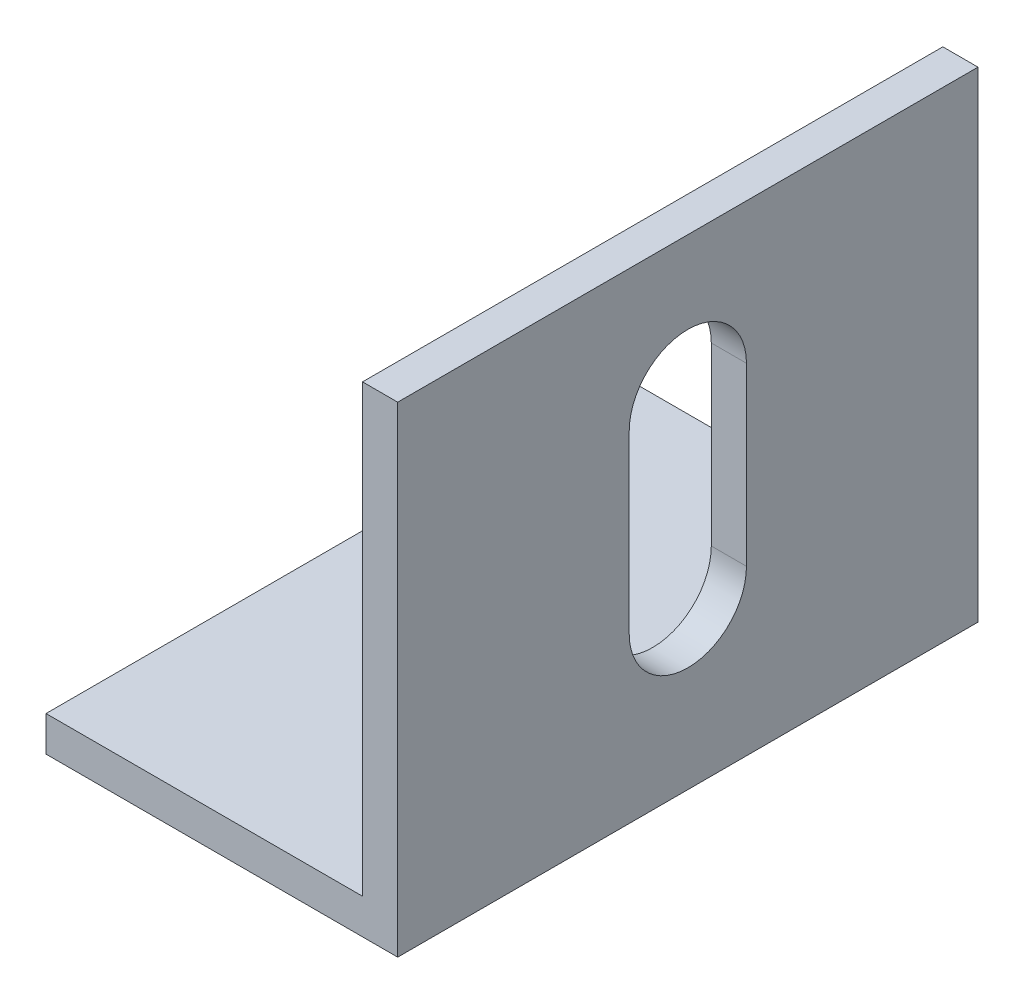
ISO-10303-21;
HEADER;
FILE_DESCRIPTION(('STEP AP214'),'2;1');
FILE_NAME('part.step','',(''),(''),'','','');
FILE_SCHEMA(('AUTOMOTIVE_DESIGN { 1 0 10303 214 1 1 1 1 }'));
ENDSEC;
DATA;
#1=APPLICATION_CONTEXT('core data for automotive mechanical design processes');
#2=APPLICATION_PROTOCOL_DEFINITION('international standard','automotive_design',2000,#1);
#3=PRODUCT_CONTEXT('',#1,'mechanical');
#4=PRODUCT('Part','Part','',(#3));
#5=PRODUCT_RELATED_PRODUCT_CATEGORY('part','',(#4));
#6=PRODUCT_DEFINITION_FORMATION('','',#4);
#7=PRODUCT_DEFINITION_CONTEXT('part definition',#1,'design');
#8=PRODUCT_DEFINITION('design','',#6,#7);
#9=PRODUCT_DEFINITION_SHAPE('','',#8);
#10=(LENGTH_UNIT() NAMED_UNIT(*) SI_UNIT(.MILLI.,.METRE.));
#11=(NAMED_UNIT(*) PLANE_ANGLE_UNIT() SI_UNIT($,.RADIAN.));
#12=(NAMED_UNIT(*) SI_UNIT($,.STERADIAN.) SOLID_ANGLE_UNIT());
#13=UNCERTAINTY_MEASURE_WITH_UNIT(LENGTH_MEASURE(1.E-05),#10,'distance_accuracy_value','');
#14=(GEOMETRIC_REPRESENTATION_CONTEXT(3) GLOBAL_UNCERTAINTY_ASSIGNED_CONTEXT((#13)) GLOBAL_UNIT_ASSIGNED_CONTEXT((#10,
#11,#12)) REPRESENTATION_CONTEXT('',''));
#15=CARTESIAN_POINT('',(0.,0.,0.));
#16=DIRECTION('',(0.,0.,1.));
#17=DIRECTION('',(1.,0.,0.));
#18=AXIS2_PLACEMENT_3D('',#15,#16,#17);
#19=CARTESIAN_POINT('',(0.,20.828,25.146));
#20=DIRECTION('',(-1.,0.,0.));
#21=DIRECTION('',(0.,-1.,0.));
#22=AXIS2_PLACEMENT_3D('',#19,#20,#21);
#23=PLANE('',#22);
#24=DIRECTION('',(0.,-1.,0.));
#25=VECTOR('',#24,1.);
#26=CARTESIAN_POINT('',(0.,14.732,15.113));
#27=LINE('',#26,#25);
#28=CARTESIAN_POINT('',(0.,14.732,15.113));
#29=VERTEX_POINT('',#28);
#30=CARTESIAN_POINT('',(0.,7.112,15.113));
#31=VERTEX_POINT('',#30);
#32=EDGE_CURVE('E132',#29,#31,#27,.T.);
#33=ORIENTED_EDGE('',*,*,#32,.F.);
#34=CARTESIAN_POINT('',(0.,14.732,12.573));
#35=DIRECTION('',(-1.,0.,0.));
#36=DIRECTION('',(0.,-1.,0.));
#37=AXIS2_PLACEMENT_3D('',#34,#35,#36);
#38=CIRCLE('',#37,2.54);
#39=CARTESIAN_POINT('',(0.,14.732,10.033));
#40=VERTEX_POINT('',#39);
#41=EDGE_CURVE('E115',#40,#29,#38,.F.);
#42=ORIENTED_EDGE('',*,*,#41,.F.);
#43=DIRECTION('',(0.,1.,0.));
#44=VECTOR('',#43,1.);
#45=CARTESIAN_POINT('',(0.,14.732,10.033));
#46=LINE('',#45,#44);
#47=CARTESIAN_POINT('',(0.,7.112,10.033));
#48=VERTEX_POINT('',#47);
#49=EDGE_CURVE('E124',#48,#40,#46,.T.);
#50=ORIENTED_EDGE('',*,*,#49,.F.);
#51=CARTESIAN_POINT('',(0.,7.112,12.573));
#52=DIRECTION('',(-1.,0.,0.));
#53=DIRECTION('',(0.,-1.,0.));
#54=AXIS2_PLACEMENT_3D('',#51,#52,#53);
#55=CIRCLE('',#54,2.54);
#56=EDGE_CURVE('E51',#31,#48,#55,.F.);
#57=ORIENTED_EDGE('',*,*,#56,.F.);
#58=EDGE_LOOP('',(#33,#42,#50,#57));
#59=FACE_BOUND('',#58,.T.);
#60=DIRECTION('',(0.,1.,0.));
#61=VECTOR('',#60,1.);
#62=CARTESIAN_POINT('',(0.,20.828,0.));
#63=LINE('',#62,#61);
#64=CARTESIAN_POINT('',(0.,0.,0.));
#65=VERTEX_POINT('',#64);
#66=CARTESIAN_POINT('',(0.,20.828,0.));
#67=VERTEX_POINT('',#66);
#68=EDGE_CURVE('E127',#65,#67,#63,.T.);
#69=ORIENTED_EDGE('',*,*,#68,.T.);
#70=DIRECTION('',(0.,0.,-1.));
#71=VECTOR('',#70,1.);
#72=CARTESIAN_POINT('',(0.,20.828,25.146));
#73=LINE('',#72,#71);
#74=CARTESIAN_POINT('',(0.,20.828,25.146));
#75=VERTEX_POINT('',#74);
#76=EDGE_CURVE('E11',#75,#67,#73,.T.);
#77=ORIENTED_EDGE('',*,*,#76,.F.);
#78=DIRECTION('',(0.,1.,0.));
#79=VECTOR('',#78,1.);
#80=CARTESIAN_POINT('',(0.,20.828,25.146));
#81=LINE('',#80,#79);
#82=CARTESIAN_POINT('',(0.,0.,25.146));
#83=VERTEX_POINT('',#82);
#84=EDGE_CURVE('E149',#83,#75,#81,.T.);
#85=ORIENTED_EDGE('',*,*,#84,.F.);
#86=DIRECTION('',(0.,0.,-1.));
#87=VECTOR('',#86,1.);
#88=CARTESIAN_POINT('',(0.,0.,25.146));
#89=LINE('',#88,#87);
#90=EDGE_CURVE('E163',#83,#65,#89,.T.);
#91=ORIENTED_EDGE('',*,*,#90,.T.);
#92=EDGE_LOOP('',(#69,#77,#85,#91));
#93=FACE_BOUND('',#92,.T.);
#94=ADVANCED_FACE('F37',(#59,#93),#23,.F.);
#95=CARTESIAN_POINT('',(-1.524,20.828,25.146));
#96=DIRECTION('',(0.,-1.,0.));
#97=DIRECTION('',(0.,0.,-1.));
#98=AXIS2_PLACEMENT_3D('',#95,#96,#97);
#99=PLANE('',#98);
#100=DIRECTION('',(-1.,0.,0.));
#101=VECTOR('',#100,1.);
#102=CARTESIAN_POINT('',(-1.524,20.828,0.));
#103=LINE('',#102,#101);
#104=CARTESIAN_POINT('',(-1.524,20.828,0.));
#105=VERTEX_POINT('',#104);
#106=EDGE_CURVE('E166',#67,#105,#103,.T.);
#107=ORIENTED_EDGE('',*,*,#106,.T.);
#108=DIRECTION('',(0.,0.,-1.));
#109=VECTOR('',#108,1.);
#110=CARTESIAN_POINT('',(-1.524,20.828,25.146));
#111=LINE('',#110,#109);
#112=CARTESIAN_POINT('',(-1.524,20.828,25.146));
#113=VERTEX_POINT('',#112);
#114=EDGE_CURVE('E44',#113,#105,#111,.T.);
#115=ORIENTED_EDGE('',*,*,#114,.F.);
#116=DIRECTION('',(-1.,0.,0.));
#117=VECTOR('',#116,1.);
#118=CARTESIAN_POINT('',(-1.524,20.828,25.146));
#119=LINE('',#118,#117);
#120=EDGE_CURVE('E152',#75,#113,#119,.T.);
#121=ORIENTED_EDGE('',*,*,#120,.F.);
#122=ORIENTED_EDGE('',*,*,#76,.T.);
#123=EDGE_LOOP('',(#107,#115,#121,#122));
#124=FACE_BOUND('',#123,.T.);
#125=ADVANCED_FACE('F213',(#124),#99,.F.);
#126=CARTESIAN_POINT('',(-1.524,1.524,25.146));
#127=DIRECTION('',(1.,0.,0.));
#128=DIRECTION('',(0.,0.,-1.));
#129=AXIS2_PLACEMENT_3D('',#126,#127,#128);
#130=PLANE('',#129);
#131=DIRECTION('',(0.,-1.,0.));
#132=VECTOR('',#131,1.);
#133=CARTESIAN_POINT('',(-1.524,14.732,10.033));
#134=LINE('',#133,#132);
#135=CARTESIAN_POINT('',(-1.524,14.732,10.033));
#136=VERTEX_POINT('',#135);
#137=CARTESIAN_POINT('',(-1.524,7.112,10.033));
#138=VERTEX_POINT('',#137);
#139=EDGE_CURVE('E134',#136,#138,#134,.T.);
#140=ORIENTED_EDGE('',*,*,#139,.F.);
#141=CARTESIAN_POINT('',(-1.524,14.732,12.573));
#142=DIRECTION('',(-1.,0.,0.));
#143=DIRECTION('',(0.,0.,1.));
#144=AXIS2_PLACEMENT_3D('',#141,#142,#143);
#145=CIRCLE('',#144,2.54);
#146=CARTESIAN_POINT('',(-1.524,14.732,15.113));
#147=VERTEX_POINT('',#146);
#148=EDGE_CURVE('E59',#147,#136,#145,.T.);
#149=ORIENTED_EDGE('',*,*,#148,.F.);
#150=DIRECTION('',(0.,1.,0.));
#151=VECTOR('',#150,1.);
#152=CARTESIAN_POINT('',(-1.524,14.732,15.113));
#153=LINE('',#152,#151);
#154=CARTESIAN_POINT('',(-1.524,7.112,15.113));
#155=VERTEX_POINT('',#154);
#156=EDGE_CURVE('E121',#155,#147,#153,.T.);
#157=ORIENTED_EDGE('',*,*,#156,.F.);
#158=CARTESIAN_POINT('',(-1.524,7.112,12.573));
#159=DIRECTION('',(-1.,0.,0.));
#160=DIRECTION('',(0.,0.,1.));
#161=AXIS2_PLACEMENT_3D('',#158,#159,#160);
#162=CIRCLE('',#161,2.54);
#163=EDGE_CURVE('E140',#138,#155,#162,.T.);
#164=ORIENTED_EDGE('',*,*,#163,.F.);
#165=EDGE_LOOP('',(#140,#149,#157,#164));
#166=FACE_BOUND('',#165,.T.);
#167=DIRECTION('',(0.,-1.,0.));
#168=VECTOR('',#167,1.);
#169=CARTESIAN_POINT('',(-1.524,1.524,0.));
#170=LINE('',#169,#168);
#171=CARTESIAN_POINT('',(-1.524,1.524,0.));
#172=VERTEX_POINT('',#171);
#173=EDGE_CURVE('E168',#105,#172,#170,.T.);
#174=ORIENTED_EDGE('',*,*,#173,.T.);
#175=DIRECTION('',(0.,0.,-1.));
#176=VECTOR('',#175,1.);
#177=CARTESIAN_POINT('',(-1.524,1.524,25.146));
#178=LINE('',#177,#176);
#179=CARTESIAN_POINT('',(-1.524,1.524,25.146));
#180=VERTEX_POINT('',#179);
#181=EDGE_CURVE('E183',#180,#172,#178,.T.);
#182=ORIENTED_EDGE('',*,*,#181,.F.);
#183=DIRECTION('',(0.,-1.,0.));
#184=VECTOR('',#183,1.);
#185=CARTESIAN_POINT('',(-1.524,1.524,25.146));
#186=LINE('',#185,#184);
#187=EDGE_CURVE('E155',#113,#180,#186,.T.);
#188=ORIENTED_EDGE('',*,*,#187,.F.);
#189=ORIENTED_EDGE('',*,*,#114,.T.);
#190=EDGE_LOOP('',(#174,#182,#188,#189));
#191=FACE_BOUND('',#190,.T.);
#192=ADVANCED_FACE('F190',(#166,#191),#130,.F.);
#193=CARTESIAN_POINT('',(-1.524,1.524,25.146));
#194=DIRECTION('',(0.,-1.,0.));
#195=DIRECTION('',(1.,0.,0.));
#196=AXIS2_PLACEMENT_3D('',#193,#194,#195);
#197=PLANE('',#196);
#198=CARTESIAN_POINT('',(-6.731,1.524,12.573));
#199=DIRECTION('',(0.,1.,0.));
#200=DIRECTION('',(-1.,0.,0.));
#201=AXIS2_PLACEMENT_3D('',#198,#199,#200);
#202=CIRCLE('',#201,2.54);
#203=CARTESIAN_POINT('',(-9.271,1.524,12.573));
#204=VERTEX_POINT('',#203);
#205=EDGE_CURVE('E243',#204,#204,#202,.T.);
#206=ORIENTED_EDGE('',*,*,#205,.F.);
#207=EDGE_LOOP('',(#206));
#208=FACE_BOUND('',#207,.T.);
#209=DIRECTION('',(-1.,0.,0.));
#210=VECTOR('',#209,1.);
#211=CARTESIAN_POINT('',(-1.524,1.524,0.));
#212=LINE('',#211,#210);
#213=CARTESIAN_POINT('',(-15.24,1.524,0.));
#214=VERTEX_POINT('',#213);
#215=EDGE_CURVE('E170',#172,#214,#212,.T.);
#216=ORIENTED_EDGE('',*,*,#215,.T.);
#217=DIRECTION('',(0.,0.,-1.));
#218=VECTOR('',#217,1.);
#219=CARTESIAN_POINT('',(-15.24,1.524,25.146));
#220=LINE('',#219,#218);
#221=CARTESIAN_POINT('',(-15.24,1.524,25.146));
#222=VERTEX_POINT('',#221);
#223=EDGE_CURVE('E180',#222,#214,#220,.T.);
#224=ORIENTED_EDGE('',*,*,#223,.F.);
#225=DIRECTION('',(-1.,0.,0.));
#226=VECTOR('',#225,1.);
#227=CARTESIAN_POINT('',(-1.524,1.524,25.146));
#228=LINE('',#227,#226);
#229=EDGE_CURVE('E157',#180,#222,#228,.T.);
#230=ORIENTED_EDGE('',*,*,#229,.F.);
#231=ORIENTED_EDGE('',*,*,#181,.T.);
#232=EDGE_LOOP('',(#216,#224,#230,#231));
#233=FACE_BOUND('',#232,.T.);
#234=ADVANCED_FACE('F201',(#208,#233),#197,.F.);
#235=CARTESIAN_POINT('',(-15.24,0.,25.146));
#236=DIRECTION('',(1.,0.,0.));
#237=DIRECTION('',(0.,0.,-1.));
#238=AXIS2_PLACEMENT_3D('',#235,#236,#237);
#239=PLANE('',#238);
#240=DIRECTION('',(0.,-1.,0.));
#241=VECTOR('',#240,1.);
#242=CARTESIAN_POINT('',(-15.24,0.,0.));
#243=LINE('',#242,#241);
#244=CARTESIAN_POINT('',(-15.24,0.,0.));
#245=VERTEX_POINT('',#244);
#246=EDGE_CURVE('E172',#214,#245,#243,.T.);
#247=ORIENTED_EDGE('',*,*,#246,.T.);
#248=DIRECTION('',(0.,0.,-1.));
#249=VECTOR('',#248,1.);
#250=CARTESIAN_POINT('',(-15.24,0.,25.146));
#251=LINE('',#250,#249);
#252=CARTESIAN_POINT('',(-15.24,0.,25.146));
#253=VERTEX_POINT('',#252);
#254=EDGE_CURVE('E177',#253,#245,#251,.T.);
#255=ORIENTED_EDGE('',*,*,#254,.F.);
#256=DIRECTION('',(0.,-1.,0.));
#257=VECTOR('',#256,1.);
#258=CARTESIAN_POINT('',(-15.24,0.,25.146));
#259=LINE('',#258,#257);
#260=EDGE_CURVE('E159',#222,#253,#259,.T.);
#261=ORIENTED_EDGE('',*,*,#260,.F.);
#262=ORIENTED_EDGE('',*,*,#223,.T.);
#263=EDGE_LOOP('',(#247,#255,#261,#262));
#264=FACE_BOUND('',#263,.T.);
#265=ADVANCED_FACE('F205',(#264),#239,.F.);
#266=CARTESIAN_POINT('',(-15.24,0.,25.146));
#267=DIRECTION('',(0.,1.,0.));
#268=DIRECTION('',(0.,0.,1.));
#269=AXIS2_PLACEMENT_3D('',#266,#267,#268);
#270=PLANE('',#269);
#271=CARTESIAN_POINT('',(-6.731,0.,12.573));
#272=DIRECTION('',(0.,1.,0.));
#273=DIRECTION('',(0.,0.,1.));
#274=AXIS2_PLACEMENT_3D('',#271,#272,#273);
#275=CIRCLE('',#274,2.54);
#276=CARTESIAN_POINT('',(-6.731,0.,15.113));
#277=VERTEX_POINT('',#276);
#278=EDGE_CURVE('E245',#277,#277,#275,.F.);
#279=ORIENTED_EDGE('',*,*,#278,.F.);
#280=EDGE_LOOP('',(#279));
#281=FACE_BOUND('',#280,.T.);
#282=DIRECTION('',(1.,0.,0.));
#283=VECTOR('',#282,1.);
#284=CARTESIAN_POINT('',(-15.24,0.,0.));
#285=LINE('',#284,#283);
#286=EDGE_CURVE('E153',#245,#65,#285,.T.);
#287=ORIENTED_EDGE('',*,*,#286,.T.);
#288=ORIENTED_EDGE('',*,*,#90,.F.);
#289=DIRECTION('',(1.,0.,0.));
#290=VECTOR('',#289,1.);
#291=CARTESIAN_POINT('',(-15.24,0.,25.146));
#292=LINE('',#291,#290);
#293=EDGE_CURVE('E161',#253,#83,#292,.T.);
#294=ORIENTED_EDGE('',*,*,#293,.F.);
#295=ORIENTED_EDGE('',*,*,#254,.T.);
#296=EDGE_LOOP('',(#287,#288,#294,#295));
#297=FACE_BOUND('',#296,.T.);
#298=ADVANCED_FACE('F215',(#281,#297),#270,.F.);
#299=CARTESIAN_POINT('',(0.,0.,25.146));
#300=DIRECTION('',(0.,0.,1.));
#301=DIRECTION('',(1.,0.,0.));
#302=AXIS2_PLACEMENT_3D('',#299,#300,#301);
#303=PLANE('',#302);
#304=ORIENTED_EDGE('',*,*,#84,.T.);
#305=ORIENTED_EDGE('',*,*,#120,.T.);
#306=ORIENTED_EDGE('',*,*,#187,.T.);
#307=ORIENTED_EDGE('',*,*,#229,.T.);
#308=ORIENTED_EDGE('',*,*,#260,.T.);
#309=ORIENTED_EDGE('',*,*,#293,.T.);
#310=EDGE_LOOP('',(#304,#305,#306,#307,#308,#309));
#311=FACE_BOUND('',#310,.T.);
#312=ADVANCED_FACE('F209',(#311),#303,.T.);
#313=CARTESIAN_POINT('',(0.,0.,0.));
#314=DIRECTION('',(0.,0.,1.));
#315=DIRECTION('',(1.,0.,0.));
#316=AXIS2_PLACEMENT_3D('',#313,#314,#315);
#317=PLANE('',#316);
#318=ORIENTED_EDGE('',*,*,#68,.F.);
#319=ORIENTED_EDGE('',*,*,#286,.F.);
#320=ORIENTED_EDGE('',*,*,#246,.F.);
#321=ORIENTED_EDGE('',*,*,#215,.F.);
#322=ORIENTED_EDGE('',*,*,#173,.F.);
#323=ORIENTED_EDGE('',*,*,#106,.F.);
#324=EDGE_LOOP('',(#318,#319,#320,#321,#322,#323));
#325=FACE_BOUND('',#324,.T.);
#326=ADVANCED_FACE('F196',(#325),#317,.F.);
#327=CARTESIAN_POINT('',(0.000999999999999916,14.732,12.573));
#328=DIRECTION('',(-1.,0.,0.));
#329=DIRECTION('',(0.,0.,1.));
#330=AXIS2_PLACEMENT_3D('',#327,#328,#329);
#331=CYLINDRICAL_SURFACE('',#330,2.54);
#332=ORIENTED_EDGE('',*,*,#41,.T.);
#333=DIRECTION('',(-1.,0.,0.));
#334=VECTOR('',#333,1.);
#335=CARTESIAN_POINT('',(0.000999999999999916,14.732,15.113));
#336=LINE('',#335,#334);
#337=EDGE_CURVE('E128',#29,#147,#336,.T.);
#338=ORIENTED_EDGE('',*,*,#337,.T.);
#339=ORIENTED_EDGE('',*,*,#148,.T.);
#340=DIRECTION('',(-1.,0.,0.));
#341=VECTOR('',#340,1.);
#342=CARTESIAN_POINT('',(0.000999999999999916,14.732,10.033));
#343=LINE('',#342,#341);
#344=EDGE_CURVE('E111',#40,#136,#343,.T.);
#345=ORIENTED_EDGE('',*,*,#344,.F.);
#346=EDGE_LOOP('',(#332,#338,#339,#345));
#347=FACE_BOUND('',#346,.T.);
#348=ADVANCED_FACE('F113',(#347),#331,.F.);
#349=CARTESIAN_POINT('',(0.000999999999999916,14.732,15.113));
#350=DIRECTION('',(0.,0.,1.));
#351=DIRECTION('',(1.,0.,0.));
#352=AXIS2_PLACEMENT_3D('',#349,#350,#351);
#353=PLANE('',#352);
#354=ORIENTED_EDGE('',*,*,#32,.T.);
#355=DIRECTION('',(-1.,0.,0.));
#356=VECTOR('',#355,1.);
#357=CARTESIAN_POINT('',(0.000999999999999916,7.112,15.113));
#358=LINE('',#357,#356);
#359=EDGE_CURVE('E146',#31,#155,#358,.T.);
#360=ORIENTED_EDGE('',*,*,#359,.T.);
#361=ORIENTED_EDGE('',*,*,#156,.T.);
#362=ORIENTED_EDGE('',*,*,#337,.F.);
#363=EDGE_LOOP('',(#354,#360,#361,#362));
#364=FACE_BOUND('',#363,.T.);
#365=ADVANCED_FACE('F259',(#364),#353,.F.);
#366=CARTESIAN_POINT('',(0.000999999999999916,7.112,12.573));
#367=DIRECTION('',(-1.,0.,0.));
#368=DIRECTION('',(0.,0.,1.));
#369=AXIS2_PLACEMENT_3D('',#366,#367,#368);
#370=CYLINDRICAL_SURFACE('',#369,2.54);
#371=ORIENTED_EDGE('',*,*,#56,.T.);
#372=DIRECTION('',(-1.,0.,0.));
#373=VECTOR('',#372,1.);
#374=CARTESIAN_POINT('',(0.000999999999999916,7.112,10.033));
#375=LINE('',#374,#373);
#376=EDGE_CURVE('E120',#48,#138,#375,.T.);
#377=ORIENTED_EDGE('',*,*,#376,.T.);
#378=ORIENTED_EDGE('',*,*,#163,.T.);
#379=ORIENTED_EDGE('',*,*,#359,.F.);
#380=EDGE_LOOP('',(#371,#377,#378,#379));
#381=FACE_BOUND('',#380,.T.);
#382=ADVANCED_FACE('F256',(#381),#370,.F.);
#383=CARTESIAN_POINT('',(0.000999999999999916,14.732,10.033));
#384=DIRECTION('',(0.,0.,-1.));
#385=DIRECTION('',(0.,1.,0.));
#386=AXIS2_PLACEMENT_3D('',#383,#384,#385);
#387=PLANE('',#386);
#388=ORIENTED_EDGE('',*,*,#49,.T.);
#389=ORIENTED_EDGE('',*,*,#344,.T.);
#390=ORIENTED_EDGE('',*,*,#139,.T.);
#391=ORIENTED_EDGE('',*,*,#376,.F.);
#392=EDGE_LOOP('',(#388,#389,#390,#391));
#393=FACE_BOUND('',#392,.T.);
#394=ADVANCED_FACE('F125',(#393),#387,.F.);
#395=CARTESIAN_POINT('',(-6.731,-0.00100000000000078,12.573));
#396=DIRECTION('',(0.,1.,0.));
#397=DIRECTION('',(-1.,0.,0.));
#398=AXIS2_PLACEMENT_3D('',#395,#396,#397);
#399=CYLINDRICAL_SURFACE('',#398,2.54);
#400=ORIENTED_EDGE('',*,*,#205,.T.);
#401=EDGE_LOOP('',(#400));
#402=FACE_BOUND('',#401,.T.);
#403=ORIENTED_EDGE('',*,*,#278,.T.);
#404=EDGE_LOOP('',(#403));
#405=FACE_BOUND('',#404,.T.);
#406=ADVANCED_FACE('F250',(#402,#405),#399,.F.);
#407=CLOSED_SHELL('',(#94,#125,#192,#234,#265,#298,#312,#326,#348,#365,#382,#394,#406));
#408=MANIFOLD_SOLID_BREP('B2',#407);
#409=ADVANCED_BREP_SHAPE_REPRESENTATION('',(#18,#408),#14);
#410=SHAPE_DEFINITION_REPRESENTATION(#9,#409);
ENDSEC;
END-ISO-10303-21;
